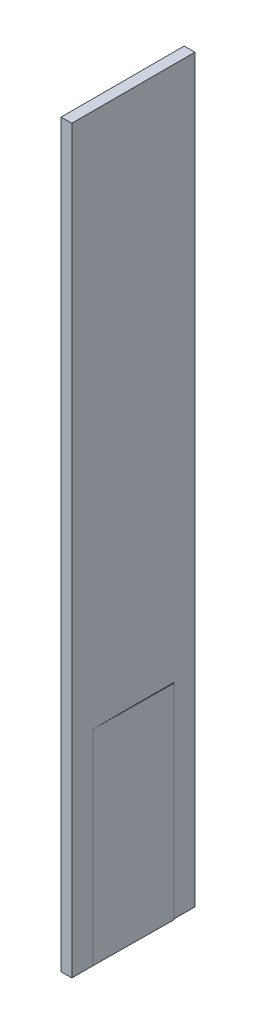
ISO-10303-21;
HEADER;
FILE_DESCRIPTION(('STEP AP214'),'2;1');
FILE_NAME('part.step','',(''),(''),'','','');
FILE_SCHEMA(('AUTOMOTIVE_DESIGN { 1 0 10303 214 1 1 1 1 }'));
ENDSEC;
DATA;
#1=APPLICATION_CONTEXT('core data for automotive mechanical design processes');
#2=APPLICATION_PROTOCOL_DEFINITION('international standard','automotive_design',2000,#1);
#3=PRODUCT_CONTEXT('',#1,'mechanical');
#4=PRODUCT('Part','Part','',(#3));
#5=PRODUCT_RELATED_PRODUCT_CATEGORY('part','',(#4));
#6=PRODUCT_DEFINITION_FORMATION('','',#4);
#7=PRODUCT_DEFINITION_CONTEXT('part definition',#1,'design');
#8=PRODUCT_DEFINITION('design','',#6,#7);
#9=PRODUCT_DEFINITION_SHAPE('','',#8);
#10=(LENGTH_UNIT() NAMED_UNIT(*) SI_UNIT(.MILLI.,.METRE.));
#11=(NAMED_UNIT(*) PLANE_ANGLE_UNIT() SI_UNIT($,.RADIAN.));
#12=(NAMED_UNIT(*) SI_UNIT($,.STERADIAN.) SOLID_ANGLE_UNIT());
#13=UNCERTAINTY_MEASURE_WITH_UNIT(LENGTH_MEASURE(1.E-05),#10,'distance_accuracy_value','');
#14=(GEOMETRIC_REPRESENTATION_CONTEXT(3) GLOBAL_UNCERTAINTY_ASSIGNED_CONTEXT((#13)) GLOBAL_UNIT_ASSIGNED_CONTEXT((#10,
#11,#12)) REPRESENTATION_CONTEXT('',''));
#15=CARTESIAN_POINT('',(0.,0.,0.));
#16=DIRECTION('',(0.,0.,1.));
#17=DIRECTION('',(1.,0.,0.));
#18=AXIS2_PLACEMENT_3D('',#15,#16,#17);
#19=CARTESIAN_POINT('',(4.85201407821626E-12,1944.65480124199,6.09031270298632E-13));
#20=DIRECTION('',(0.,1.,0.));
#21=DIRECTION('',(-1.,0.,0.));
#22=AXIS2_PLACEMENT_3D('',#19,#20,#21);
#23=PLANE('',#22);
#24=DIRECTION('',(-0.999961923064171,0.,-0.00872653549837454));
#25=VECTOR('',#24,1.);
#26=CARTESIAN_POINT('',(-38.0966149604045,1944.65480124199,380.224210994195));
#27=LINE('',#26,#25);
#28=CARTESIAN_POINT('',(50.8,1944.65480124199,381.000000000001));
#29=VERTEX_POINT('',#28);
#30=CARTESIAN_POINT('',(-38.0966149604045,1944.65480124199,380.224210994195));
#31=VERTEX_POINT('',#30);
#32=EDGE_CURVE('E97',#29,#31,#27,.T.);
#33=ORIENTED_EDGE('',*,*,#32,.F.);
#34=DIRECTION('',(-0.00872653549837487,0.,0.999961923064171));
#35=VECTOR('',#34,1.);
#36=CARTESIAN_POINT('',(50.8,1944.65480124199,381.000000000001));
#37=LINE('',#36,#35);
#38=CARTESIAN_POINT('',(57.4496200497617,1944.65480124199,-380.970985374898));
#39=VERTEX_POINT('',#38);
#40=EDGE_CURVE('E108',#39,#29,#37,.T.);
#41=ORIENTED_EDGE('',*,*,#40,.F.);
#42=DIRECTION('',(0.999961923064171,0.,0.00872653549837514));
#43=VECTOR('',#42,1.);
#44=CARTESIAN_POINT('',(57.4496200497617,1944.65480124199,-380.970985374898));
#45=LINE('',#44,#43);
#46=CARTESIAN_POINT('',(-31.4469949106431,1944.65480124199,-381.746774380703));
#47=VERTEX_POINT('',#46);
#48=EDGE_CURVE('E99',#47,#39,#45,.T.);
#49=ORIENTED_EDGE('',*,*,#48,.F.);
#50=DIRECTION('',(0.0087265354983745,0.,-0.999961923064171));
#51=VECTOR('',#50,1.);
#52=CARTESIAN_POINT('',(-31.4469949106431,1944.65480124199,-381.746774380703));
#53=LINE('',#52,#51);
#54=EDGE_CURVE('E89',#31,#47,#53,.T.);
#55=ORIENTED_EDGE('',*,*,#54,.F.);
#56=EDGE_LOOP('',(#33,#41,#49,#55));
#57=FACE_BOUND('',#56,.T.);
#58=ADVANCED_FACE('F47',(#57),#23,.T.);
#59=CARTESIAN_POINT('',(50.8,-768.707828015812,381.));
#60=DIRECTION('',(-0.999961923064171,0.,-0.00872653549837487));
#61=DIRECTION('',(-0.00872653549837487,0.,0.999961923064171));
#62=AXIS2_PLACEMENT_3D('',#59,#60,#61);
#63=PLANE('',#62);
#64=DIRECTION('',(0.,1.,0.));
#65=VECTOR('',#64,1.);
#66=CARTESIAN_POINT('',(50.8,-768.707828015812,381.));
#67=LINE('',#66,#65);
#68=CARTESIAN_POINT('',(50.8,0.,381.000000000001));
#69=VERTEX_POINT('',#68);
#70=EDGE_CURVE('E102',#69,#29,#67,.T.);
#71=ORIENTED_EDGE('',*,*,#70,.F.);
#72=DIRECTION('',(0.00872653549837487,0.,-0.999961923064171));
#73=VECTOR('',#72,1.);
#74=CARTESIAN_POINT('',(50.8,0.,381.));
#75=LINE('',#74,#73);
#76=CARTESIAN_POINT('',(57.4496200497617,0.,-380.970985374898));
#77=VERTEX_POINT('',#76);
#78=EDGE_CURVE('E51',#69,#77,#75,.T.);
#79=ORIENTED_EDGE('',*,*,#78,.T.);
#80=DIRECTION('',(0.,1.,0.));
#81=VECTOR('',#80,1.);
#82=CARTESIAN_POINT('',(57.4496200497617,-768.707828015812,-380.970985374899));
#83=LINE('',#82,#81);
#84=EDGE_CURVE('E111',#77,#39,#83,.T.);
#85=ORIENTED_EDGE('',*,*,#84,.T.);
#86=ORIENTED_EDGE('',*,*,#40,.T.);
#87=EDGE_LOOP('',(#71,#79,#85,#86));
#88=FACE_BOUND('',#87,.T.);
#89=ADVANCED_FACE('F120',(#88),#63,.F.);
#90=CARTESIAN_POINT('',(57.4496200497617,-768.707828015812,-380.970985374899));
#91=DIRECTION('',(-0.00872653549837514,0.,0.999961923064171));
#92=DIRECTION('',(0.999961923064171,0.,0.00872653549837514));
#93=AXIS2_PLACEMENT_3D('',#90,#91,#92);
#94=PLANE('',#93);
#95=ORIENTED_EDGE('',*,*,#84,.F.);
#96=DIRECTION('',(-0.999961923064171,0.,-0.00872653549837514));
#97=VECTOR('',#96,1.);
#98=CARTESIAN_POINT('',(57.4496200497617,0.,-380.970985374898));
#99=LINE('',#98,#97);
#100=CARTESIAN_POINT('',(-31.4469949106431,0.,-381.746774380704));
#101=VERTEX_POINT('',#100);
#102=EDGE_CURVE('E117',#77,#101,#99,.T.);
#103=ORIENTED_EDGE('',*,*,#102,.T.);
#104=DIRECTION('',(0.,1.,0.));
#105=VECTOR('',#104,1.);
#106=CARTESIAN_POINT('',(-31.4469949106431,-768.707828015812,-381.746774380704));
#107=LINE('',#106,#105);
#108=EDGE_CURVE('E93',#101,#47,#107,.T.);
#109=ORIENTED_EDGE('',*,*,#108,.T.);
#110=ORIENTED_EDGE('',*,*,#48,.T.);
#111=EDGE_LOOP('',(#95,#103,#109,#110));
#112=FACE_BOUND('',#111,.T.);
#113=ADVANCED_FACE('F116',(#112),#94,.F.);
#114=CARTESIAN_POINT('',(-31.4469949106431,-768.707828015812,-381.746774380704));
#115=DIRECTION('',(0.999961923064171,0.,0.0087265354983745));
#116=DIRECTION('',(0.0087265354983745,0.,-0.999961923064171));
#117=AXIS2_PLACEMENT_3D('',#114,#115,#116);
#118=PLANE('',#117);
#119=ORIENTED_EDGE('',*,*,#108,.F.);
#120=DIRECTION('',(-0.0087265354983745,0.,0.999961923064171));
#121=VECTOR('',#120,1.);
#122=CARTESIAN_POINT('',(-31.4469949106431,0.,-381.746774380704));
#123=LINE('',#122,#121);
#124=CARTESIAN_POINT('',(-38.0966149604045,0.,380.224210994195));
#125=VERTEX_POINT('',#124);
#126=EDGE_CURVE('E56',#101,#125,#123,.T.);
#127=ORIENTED_EDGE('',*,*,#126,.T.);
#128=DIRECTION('',(0.,1.,0.));
#129=VECTOR('',#128,1.);
#130=CARTESIAN_POINT('',(-38.0966149604045,-768.707828015812,380.224210994195));
#131=LINE('',#130,#129);
#132=EDGE_CURVE('E86',#125,#31,#131,.T.);
#133=ORIENTED_EDGE('',*,*,#132,.T.);
#134=ORIENTED_EDGE('',*,*,#54,.T.);
#135=EDGE_LOOP('',(#119,#127,#133,#134));
#136=FACE_BOUND('',#135,.T.);
#137=ADVANCED_FACE('F88',(#136),#118,.F.);
#138=CARTESIAN_POINT('',(-38.0966149604045,-768.707828015812,380.224210994195));
#139=DIRECTION('',(0.00872653549837454,0.,-0.999961923064171));
#140=DIRECTION('',(-0.999961923064171,0.,-0.00872653549837454));
#141=AXIS2_PLACEMENT_3D('',#138,#139,#140);
#142=PLANE('',#141);
#143=ORIENTED_EDGE('',*,*,#132,.F.);
#144=DIRECTION('',(0.999961923064171,0.,0.00872653549837454));
#145=VECTOR('',#144,1.);
#146=CARTESIAN_POINT('',(-38.0966149604045,0.,380.224210994195));
#147=LINE('',#146,#145);
#148=EDGE_CURVE('E12',#125,#69,#147,.T.);
#149=ORIENTED_EDGE('',*,*,#148,.T.);
#150=ORIENTED_EDGE('',*,*,#70,.T.);
#151=ORIENTED_EDGE('',*,*,#32,.T.);
#152=EDGE_LOOP('',(#143,#149,#150,#151));
#153=FACE_BOUND('',#152,.T.);
#154=ADVANCED_FACE('F49',(#153),#142,.F.);
#155=CARTESIAN_POINT('',(0.,0.,0.));
#156=DIRECTION('',(0.,1.,0.));
#157=DIRECTION('',(0.,0.,1.));
#158=AXIS2_PLACEMENT_3D('',#155,#156,#157);
#159=PLANE('',#158);
#160=ORIENTED_EDGE('',*,*,#126,.F.);
#161=ORIENTED_EDGE('',*,*,#102,.F.);
#162=ORIENTED_EDGE('',*,*,#78,.F.);
#163=ORIENTED_EDGE('',*,*,#148,.F.);
#164=EDGE_LOOP('',(#160,#161,#162,#163));
#165=FACE_BOUND('',#164,.T.);
#166=ADVANCED_FACE('F134',(#165),#159,.F.);
#167=CLOSED_SHELL('',(#58,#89,#113,#137,#154,#166));
#168=MANIFOLD_SOLID_BREP('B2',#167);
#169=CARTESIAN_POINT('',(0.,0.,0.));
#170=DIRECTION('',(0.,1.,0.));
#171=DIRECTION('',(0.,0.,1.));
#172=AXIS2_PLACEMENT_3D('',#169,#170,#171);
#173=PLANE('',#172);
#174=DIRECTION('',(0.,0.,-1.));
#175=VECTOR('',#174,1.);
#176=CARTESIAN_POINT('',(50.7999999999999,0.,-584.2));
#177=LINE('',#176,#175);
#178=CARTESIAN_POINT('',(50.7999999999999,6.93889390390723E-13,-380.999999999999));
#179=VERTEX_POINT('',#178);
#180=CARTESIAN_POINT('',(50.7999999999999,0.,-584.2));
#181=VERTEX_POINT('',#180);
#182=EDGE_CURVE('E279',#179,#181,#177,.T.);
#183=ORIENTED_EDGE('',*,*,#182,.F.);
#184=DIRECTION('',(1.,0.,0.));
#185=VECTOR('',#184,1.);
#186=CARTESIAN_POINT('',(-50.8000000000002,6.93889390390723E-13,-380.999999999999));
#187=LINE('',#186,#185);
#188=CARTESIAN_POINT('',(-50.8000000000002,6.93889390390723E-13,-380.999999999999));
#189=VERTEX_POINT('',#188);
#190=EDGE_CURVE('E277',#189,#179,#187,.T.);
#191=ORIENTED_EDGE('',*,*,#190,.F.);
#192=DIRECTION('',(0.,0.,1.));
#193=VECTOR('',#192,1.);
#194=CARTESIAN_POINT('',(-50.8000000000001,0.,-584.2));
#195=LINE('',#194,#193);
#196=CARTESIAN_POINT('',(-50.8000000000001,0.,-584.2));
#197=VERTEX_POINT('',#196);
#198=EDGE_CURVE('E269',#197,#189,#195,.T.);
#199=ORIENTED_EDGE('',*,*,#198,.F.);
#200=DIRECTION('',(-1.,0.,0.));
#201=VECTOR('',#200,1.);
#202=CARTESIAN_POINT('',(-50.8000000000001,0.,-584.2));
#203=LINE('',#202,#201);
#204=EDGE_CURVE('E293',#181,#197,#203,.T.);
#205=ORIENTED_EDGE('',*,*,#204,.F.);
#206=EDGE_LOOP('',(#183,#191,#199,#205));
#207=FACE_BOUND('',#206,.T.);
#208=ADVANCED_FACE('F171',(#207),#173,.F.);
#209=CARTESIAN_POINT('',(50.7999999999999,7023.1,-584.2));
#210=DIRECTION('',(-1.,0.,0.));
#211=DIRECTION('',(0.,0.,1.));
#212=AXIS2_PLACEMENT_3D('',#209,#210,#211);
#213=PLANE('',#212);
#214=DIRECTION('',(0.,0.,1.));
#215=VECTOR('',#214,1.);
#216=CARTESIAN_POINT('',(50.8,1944.65480124199,381.000000000001));
#217=LINE('',#216,#215);
#218=CARTESIAN_POINT('',(50.7999999999999,1944.65480124199,-380.999999999999));
#219=VERTEX_POINT('',#218);
#220=CARTESIAN_POINT('',(50.8,1944.65480124199,381.000000000001));
#221=VERTEX_POINT('',#220);
#222=EDGE_CURVE('E271',#219,#221,#217,.T.);
#223=ORIENTED_EDGE('',*,*,#222,.F.);
#224=DIRECTION('',(0.,1.,0.));
#225=VECTOR('',#224,1.);
#226=CARTESIAN_POINT('',(50.7999999999999,1944.65480124199,-380.999999999999));
#227=LINE('',#226,#225);
#228=EDGE_CURVE('E251',#179,#219,#227,.T.);
#229=ORIENTED_EDGE('',*,*,#228,.F.);
#230=ORIENTED_EDGE('',*,*,#182,.T.);
#231=DIRECTION('',(0.,-1.,0.));
#232=VECTOR('',#231,1.);
#233=CARTESIAN_POINT('',(50.7999999999999,7023.1,-584.2));
#234=LINE('',#233,#232);
#235=CARTESIAN_POINT('',(50.7999999999999,7023.1,-584.2));
#236=VERTEX_POINT('',#235);
#237=EDGE_CURVE('E45',#236,#181,#234,.T.);
#238=ORIENTED_EDGE('',*,*,#237,.F.);
#239=DIRECTION('',(0.,0.,-1.));
#240=VECTOR('',#239,1.);
#241=CARTESIAN_POINT('',(50.7999999999999,7023.1,-584.2));
#242=LINE('',#241,#240);
#243=CARTESIAN_POINT('',(50.8000000000001,7023.1,584.2));
#244=VERTEX_POINT('',#243);
#245=EDGE_CURVE('E283',#244,#236,#242,.T.);
#246=ORIENTED_EDGE('',*,*,#245,.F.);
#247=DIRECTION('',(0.,-1.,0.));
#248=VECTOR('',#247,1.);
#249=CARTESIAN_POINT('',(50.8000000000001,7023.1,584.2));
#250=LINE('',#249,#248);
#251=CARTESIAN_POINT('',(50.8000000000001,0.,584.2));
#252=VERTEX_POINT('',#251);
#253=EDGE_CURVE('E289',#244,#252,#250,.T.);
#254=ORIENTED_EDGE('',*,*,#253,.T.);
#255=CARTESIAN_POINT('',(50.8,0.,381.000000000001));
#256=VERTEX_POINT('',#255);
#257=EDGE_CURVE('E290',#252,#256,#177,.T.);
#258=ORIENTED_EDGE('',*,*,#257,.T.);
#259=DIRECTION('',(0.,-1.,0.));
#260=VECTOR('',#259,1.);
#261=CARTESIAN_POINT('',(50.8,1944.65480124199,381.000000000001));
#262=LINE('',#261,#260);
#263=EDGE_CURVE('E186',#221,#256,#262,.T.);
#264=ORIENTED_EDGE('',*,*,#263,.F.);
#265=EDGE_LOOP('',(#223,#229,#230,#238,#246,#254,#258,#264));
#266=FACE_BOUND('',#265,.T.);
#267=ADVANCED_FACE('F173',(#266),#213,.F.);
#268=CARTESIAN_POINT('',(-50.8000000000001,7023.1,-584.2));
#269=DIRECTION('',(0.,0.,1.));
#270=DIRECTION('',(1.,0.,0.));
#271=AXIS2_PLACEMENT_3D('',#268,#269,#270);
#272=PLANE('',#271);
#273=ORIENTED_EDGE('',*,*,#204,.T.);
#274=DIRECTION('',(0.,-1.,0.));
#275=VECTOR('',#274,1.);
#276=CARTESIAN_POINT('',(-50.8000000000001,7023.1,-584.2));
#277=LINE('',#276,#275);
#278=CARTESIAN_POINT('',(-50.8000000000001,7023.1,-584.2));
#279=VERTEX_POINT('',#278);
#280=EDGE_CURVE('E179',#279,#197,#277,.T.);
#281=ORIENTED_EDGE('',*,*,#280,.F.);
#282=DIRECTION('',(-1.,0.,0.));
#283=VECTOR('',#282,1.);
#284=CARTESIAN_POINT('',(-50.8000000000001,7023.1,-584.2));
#285=LINE('',#284,#283);
#286=EDGE_CURVE('E223',#236,#279,#285,.T.);
#287=ORIENTED_EDGE('',*,*,#286,.F.);
#288=ORIENTED_EDGE('',*,*,#237,.T.);
#289=EDGE_LOOP('',(#273,#281,#287,#288));
#290=FACE_BOUND('',#289,.T.);
#291=ADVANCED_FACE('F328',(#290),#272,.F.);
#292=CARTESIAN_POINT('',(-50.8000000000001,7023.1,-584.2));
#293=DIRECTION('',(1.,0.,0.));
#294=DIRECTION('',(0.,0.,-1.));
#295=AXIS2_PLACEMENT_3D('',#292,#293,#294);
#296=PLANE('',#295);
#297=ORIENTED_EDGE('',*,*,#198,.T.);
#298=DIRECTION('',(0.,1.,0.));
#299=VECTOR('',#298,1.);
#300=CARTESIAN_POINT('',(-50.8000000000002,1944.65480124199,-380.999999999999));
#301=LINE('',#300,#299);
#302=CARTESIAN_POINT('',(-50.8000000000002,1944.65480124199,-380.999999999999));
#303=VERTEX_POINT('',#302);
#304=EDGE_CURVE('E248',#189,#303,#301,.T.);
#305=ORIENTED_EDGE('',*,*,#304,.T.);
#306=DIRECTION('',(0.,0.,1.));
#307=VECTOR('',#306,1.);
#308=CARTESIAN_POINT('',(-50.8000000000001,1944.65480124199,381.000000000001));
#309=LINE('',#308,#307);
#310=CARTESIAN_POINT('',(-50.8000000000001,1944.65480124199,381.000000000001));
#311=VERTEX_POINT('',#310);
#312=EDGE_CURVE('E259',#303,#311,#309,.T.);
#313=ORIENTED_EDGE('',*,*,#312,.T.);
#314=DIRECTION('',(0.,-1.,0.));
#315=VECTOR('',#314,1.);
#316=CARTESIAN_POINT('',(-50.8000000000001,1944.65480124199,381.000000000001));
#317=LINE('',#316,#315);
#318=CARTESIAN_POINT('',(-50.8000000000001,6.00571304295695E-13,381.000000000001));
#319=VERTEX_POINT('',#318);
#320=EDGE_CURVE('E256',#311,#319,#317,.T.);
#321=ORIENTED_EDGE('',*,*,#320,.T.);
#322=CARTESIAN_POINT('',(-50.7999999999999,0.,584.2));
#323=VERTEX_POINT('',#322);
#324=EDGE_CURVE('E295',#319,#323,#195,.T.);
#325=ORIENTED_EDGE('',*,*,#324,.T.);
#326=DIRECTION('',(0.,-1.,0.));
#327=VECTOR('',#326,1.);
#328=CARTESIAN_POINT('',(-50.7999999999999,7023.1,584.2));
#329=LINE('',#328,#327);
#330=CARTESIAN_POINT('',(-50.7999999999999,7023.1,584.2));
#331=VERTEX_POINT('',#330);
#332=EDGE_CURVE('E299',#331,#323,#329,.T.);
#333=ORIENTED_EDGE('',*,*,#332,.F.);
#334=DIRECTION('',(0.,0.,1.));
#335=VECTOR('',#334,1.);
#336=CARTESIAN_POINT('',(-50.8000000000001,7023.1,-584.2));
#337=LINE('',#336,#335);
#338=EDGE_CURVE('E286',#279,#331,#337,.T.);
#339=ORIENTED_EDGE('',*,*,#338,.F.);
#340=ORIENTED_EDGE('',*,*,#280,.T.);
#341=EDGE_LOOP('',(#297,#305,#313,#321,#325,#333,#339,#340));
#342=FACE_BOUND('',#341,.T.);
#343=ADVANCED_FACE('F266',(#342),#296,.F.);
#344=CARTESIAN_POINT('',(-50.7999999999999,7023.1,584.2));
#345=DIRECTION('',(0.,0.,-1.));
#346=DIRECTION('',(-1.,0.,0.));
#347=AXIS2_PLACEMENT_3D('',#344,#345,#346);
#348=PLANE('',#347);
#349=DIRECTION('',(1.,0.,0.));
#350=VECTOR('',#349,1.);
#351=CARTESIAN_POINT('',(-50.7999999999999,0.,584.2));
#352=LINE('',#351,#350);
#353=EDGE_CURVE('E216',#323,#252,#352,.T.);
#354=ORIENTED_EDGE('',*,*,#353,.T.);
#355=ORIENTED_EDGE('',*,*,#253,.F.);
#356=DIRECTION('',(1.,0.,0.));
#357=VECTOR('',#356,1.);
#358=CARTESIAN_POINT('',(-50.7999999999999,7023.1,584.2));
#359=LINE('',#358,#357);
#360=EDGE_CURVE('E195',#331,#244,#359,.T.);
#361=ORIENTED_EDGE('',*,*,#360,.F.);
#362=ORIENTED_EDGE('',*,*,#332,.T.);
#363=EDGE_LOOP('',(#354,#355,#361,#362));
#364=FACE_BOUND('',#363,.T.);
#365=ADVANCED_FACE('F313',(#364),#348,.F.);
#366=CARTESIAN_POINT('',(0.,7023.1,0.));
#367=DIRECTION('',(0.,1.,0.));
#368=DIRECTION('',(0.,0.,1.));
#369=AXIS2_PLACEMENT_3D('',#366,#367,#368);
#370=PLANE('',#369);
#371=ORIENTED_EDGE('',*,*,#245,.T.);
#372=ORIENTED_EDGE('',*,*,#286,.T.);
#373=ORIENTED_EDGE('',*,*,#338,.T.);
#374=ORIENTED_EDGE('',*,*,#360,.T.);
#375=EDGE_LOOP('',(#371,#372,#373,#374));
#376=FACE_BOUND('',#375,.T.);
#377=ADVANCED_FACE('F314',(#376),#370,.T.);
#378=ORIENTED_EDGE('',*,*,#324,.F.);
#379=DIRECTION('',(1.,0.,0.));
#380=VECTOR('',#379,1.);
#381=CARTESIAN_POINT('',(-50.8000000000001,6.00571304295695E-13,381.000000000001));
#382=LINE('',#381,#380);
#383=EDGE_CURVE('E280',#319,#256,#382,.T.);
#384=ORIENTED_EDGE('',*,*,#383,.T.);
#385=ORIENTED_EDGE('',*,*,#257,.F.);
#386=ORIENTED_EDGE('',*,*,#353,.F.);
#387=EDGE_LOOP('',(#378,#384,#385,#386));
#388=FACE_BOUND('',#387,.T.);
#389=ADVANCED_FACE('F311',(#388),#173,.F.);
#390=CARTESIAN_POINT('',(-50.8000000000002,1944.65480124199,-380.999999999999));
#391=DIRECTION('',(0.,0.,-1.));
#392=DIRECTION('',(-1.,0.,0.));
#393=AXIS2_PLACEMENT_3D('',#390,#391,#392);
#394=PLANE('',#393);
#395=ORIENTED_EDGE('',*,*,#228,.T.);
#396=DIRECTION('',(1.,0.,0.));
#397=VECTOR('',#396,1.);
#398=CARTESIAN_POINT('',(-50.8000000000002,1944.65480124199,-380.999999999999));
#399=LINE('',#398,#397);
#400=EDGE_CURVE('E244',#303,#219,#399,.T.);
#401=ORIENTED_EDGE('',*,*,#400,.F.);
#402=ORIENTED_EDGE('',*,*,#304,.F.);
#403=ORIENTED_EDGE('',*,*,#190,.T.);
#404=EDGE_LOOP('',(#395,#401,#402,#403));
#405=FACE_BOUND('',#404,.T.);
#406=ADVANCED_FACE('F246',(#405),#394,.F.);
#407=CARTESIAN_POINT('',(-50.8000000000001,1944.65480124199,381.000000000001));
#408=DIRECTION('',(0.,0.,1.));
#409=DIRECTION('',(1.,0.,0.));
#410=AXIS2_PLACEMENT_3D('',#407,#408,#409);
#411=PLANE('',#410);
#412=ORIENTED_EDGE('',*,*,#263,.T.);
#413=ORIENTED_EDGE('',*,*,#383,.F.);
#414=ORIENTED_EDGE('',*,*,#320,.F.);
#415=DIRECTION('',(1.,0.,0.));
#416=VECTOR('',#415,1.);
#417=CARTESIAN_POINT('',(-50.8000000000001,1944.65480124199,381.000000000001));
#418=LINE('',#417,#416);
#419=EDGE_CURVE('E255',#311,#221,#418,.T.);
#420=ORIENTED_EDGE('',*,*,#419,.T.);
#421=EDGE_LOOP('',(#412,#413,#414,#420));
#422=FACE_BOUND('',#421,.T.);
#423=ADVANCED_FACE('F312',(#422),#411,.F.);
#424=CARTESIAN_POINT('',(-50.8000000000001,1944.65480124199,381.000000000001));
#425=DIRECTION('',(0.,1.,0.));
#426=DIRECTION('',(0.,0.,1.));
#427=AXIS2_PLACEMENT_3D('',#424,#425,#426);
#428=PLANE('',#427);
#429=ORIENTED_EDGE('',*,*,#222,.T.);
#430=ORIENTED_EDGE('',*,*,#419,.F.);
#431=ORIENTED_EDGE('',*,*,#312,.F.);
#432=ORIENTED_EDGE('',*,*,#400,.T.);
#433=EDGE_LOOP('',(#429,#430,#431,#432));
#434=FACE_BOUND('',#433,.T.);
#435=ADVANCED_FACE('F260',(#434),#428,.F.);
#436=CLOSED_SHELL('',(#208,#267,#291,#343,#365,#377,#389,#406,#423,#435));
#437=MANIFOLD_SOLID_BREP('B6',#436);
#438=ADVANCED_BREP_SHAPE_REPRESENTATION('',(#18,#168,#437),#14);
#439=SHAPE_DEFINITION_REPRESENTATION(#9,#438);
ENDSEC;
END-ISO-10303-21;
